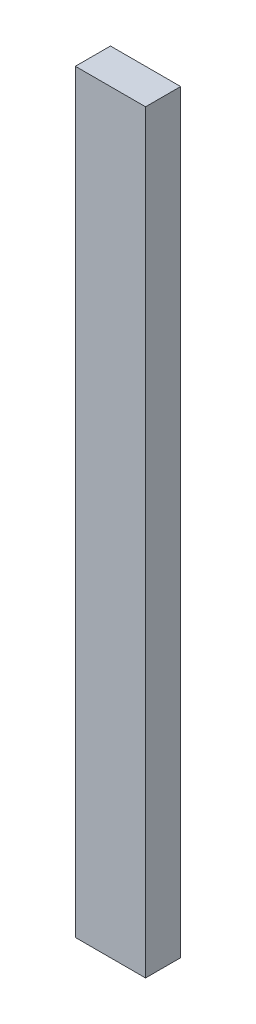
ISO-10303-21;
HEADER;
FILE_DESCRIPTION(('STEP AP214'),'2;1');
FILE_NAME('part.step','',(''),(''),'','','');
FILE_SCHEMA(('AUTOMOTIVE_DESIGN { 1 0 10303 214 1 1 1 1 }'));
ENDSEC;
DATA;
#1=APPLICATION_CONTEXT('core data for automotive mechanical design processes');
#2=APPLICATION_PROTOCOL_DEFINITION('international standard','automotive_design',2000,#1);
#3=PRODUCT_CONTEXT('',#1,'mechanical');
#4=PRODUCT('Part','Part','',(#3));
#5=PRODUCT_RELATED_PRODUCT_CATEGORY('part','',(#4));
#6=PRODUCT_DEFINITION_FORMATION('','',#4);
#7=PRODUCT_DEFINITION_CONTEXT('part definition',#1,'design');
#8=PRODUCT_DEFINITION('design','',#6,#7);
#9=PRODUCT_DEFINITION_SHAPE('','',#8);
#10=(LENGTH_UNIT() NAMED_UNIT(*) SI_UNIT(.MILLI.,.METRE.));
#11=(NAMED_UNIT(*) PLANE_ANGLE_UNIT() SI_UNIT($,.RADIAN.));
#12=(NAMED_UNIT(*) SI_UNIT($,.STERADIAN.) SOLID_ANGLE_UNIT());
#13=UNCERTAINTY_MEASURE_WITH_UNIT(LENGTH_MEASURE(1.E-05),#10,'distance_accuracy_value','');
#14=(GEOMETRIC_REPRESENTATION_CONTEXT(3) GLOBAL_UNCERTAINTY_ASSIGNED_CONTEXT((#13)) GLOBAL_UNIT_ASSIGNED_CONTEXT((#10,
#11,#12)) REPRESENTATION_CONTEXT('',''));
#15=CARTESIAN_POINT('',(0.,0.,0.));
#16=DIRECTION('',(0.,0.,1.));
#17=DIRECTION('',(1.,0.,0.));
#18=AXIS2_PLACEMENT_3D('',#15,#16,#17);
#19=CARTESIAN_POINT('',(12.7,-7.93749999999993,6.35));
#20=DIRECTION('',(-1.,0.,0.));
#21=DIRECTION('',(0.,0.,1.));
#22=AXIS2_PLACEMENT_3D('',#19,#20,#21);
#23=PLANE('',#22);
#24=DIRECTION('',(0.,1.,0.));
#25=VECTOR('',#24,1.);
#26=CARTESIAN_POINT('',(12.7,-7.93749999999993,0.));
#27=LINE('',#26,#25);
#28=CARTESIAN_POINT('',(12.7,-144.4625,0.));
#29=VERTEX_POINT('',#28);
#30=CARTESIAN_POINT('',(12.7,-7.93749999999993,0.));
#31=VERTEX_POINT('',#30);
#32=EDGE_CURVE('E96',#29,#31,#27,.T.);
#33=ORIENTED_EDGE('',*,*,#32,.T.);
#34=DIRECTION('',(0.,0.,-1.));
#35=VECTOR('',#34,1.);
#36=CARTESIAN_POINT('',(12.7,-7.93749999999993,6.35));
#37=LINE('',#36,#35);
#38=CARTESIAN_POINT('',(12.7,-7.93749999999993,6.35));
#39=VERTEX_POINT('',#38);
#40=EDGE_CURVE('E11',#39,#31,#37,.T.);
#41=ORIENTED_EDGE('',*,*,#40,.F.);
#42=DIRECTION('',(0.,1.,0.));
#43=VECTOR('',#42,1.);
#44=CARTESIAN_POINT('',(12.7,-7.93749999999993,6.35));
#45=LINE('',#44,#43);
#46=CARTESIAN_POINT('',(12.7,-144.4625,6.35));
#47=VERTEX_POINT('',#46);
#48=EDGE_CURVE('E84',#47,#39,#45,.T.);
#49=ORIENTED_EDGE('',*,*,#48,.F.);
#50=DIRECTION('',(0.,0.,-1.));
#51=VECTOR('',#50,1.);
#52=CARTESIAN_POINT('',(12.7,-144.4625,6.35));
#53=LINE('',#52,#51);
#54=EDGE_CURVE('E92',#47,#29,#53,.T.);
#55=ORIENTED_EDGE('',*,*,#54,.T.);
#56=EDGE_LOOP('',(#33,#41,#49,#55));
#57=FACE_BOUND('',#56,.T.);
#58=ADVANCED_FACE('F33',(#57),#23,.F.);
#59=CARTESIAN_POINT('',(12.7,-7.93749999999993,6.35));
#60=DIRECTION('',(0.,-1.,0.));
#61=DIRECTION('',(0.,0.,-1.));
#62=AXIS2_PLACEMENT_3D('',#59,#60,#61);
#63=PLANE('',#62);
#64=DIRECTION('',(-1.,0.,0.));
#65=VECTOR('',#64,1.);
#66=CARTESIAN_POINT('',(12.7,-7.93749999999993,0.));
#67=LINE('',#66,#65);
#68=CARTESIAN_POINT('',(0.,-7.93749999999993,0.));
#69=VERTEX_POINT('',#68);
#70=EDGE_CURVE('E88',#31,#69,#67,.T.);
#71=ORIENTED_EDGE('',*,*,#70,.T.);
#72=DIRECTION('',(0.,0.,-1.));
#73=VECTOR('',#72,1.);
#74=CARTESIAN_POINT('',(0.,-7.93749999999993,6.35));
#75=LINE('',#74,#73);
#76=CARTESIAN_POINT('',(0.,-7.93749999999993,6.35));
#77=VERTEX_POINT('',#76);
#78=EDGE_CURVE('E41',#77,#69,#75,.T.);
#79=ORIENTED_EDGE('',*,*,#78,.F.);
#80=DIRECTION('',(-1.,0.,0.));
#81=VECTOR('',#80,1.);
#82=CARTESIAN_POINT('',(12.7,-7.93749999999993,6.35));
#83=LINE('',#82,#81);
#84=EDGE_CURVE('E79',#39,#77,#83,.T.);
#85=ORIENTED_EDGE('',*,*,#84,.F.);
#86=ORIENTED_EDGE('',*,*,#40,.T.);
#87=EDGE_LOOP('',(#71,#79,#85,#86));
#88=FACE_BOUND('',#87,.T.);
#89=ADVANCED_FACE('F87',(#88),#63,.F.);
#90=CARTESIAN_POINT('',(0.,-7.93749999999993,6.35));
#91=DIRECTION('',(1.,0.,0.));
#92=DIRECTION('',(0.,0.,-1.));
#93=AXIS2_PLACEMENT_3D('',#90,#91,#92);
#94=PLANE('',#93);
#95=DIRECTION('',(0.,-1.,0.));
#96=VECTOR('',#95,1.);
#97=CARTESIAN_POINT('',(0.,-7.93749999999993,0.));
#98=LINE('',#97,#96);
#99=CARTESIAN_POINT('',(0.,-144.4625,0.));
#100=VERTEX_POINT('',#99);
#101=EDGE_CURVE('E66',#69,#100,#98,.T.);
#102=ORIENTED_EDGE('',*,*,#101,.T.);
#103=DIRECTION('',(0.,0.,-1.));
#104=VECTOR('',#103,1.);
#105=CARTESIAN_POINT('',(0.,-144.4625,6.35));
#106=LINE('',#105,#104);
#107=CARTESIAN_POINT('',(0.,-144.4625,6.35));
#108=VERTEX_POINT('',#107);
#109=EDGE_CURVE('E89',#108,#100,#106,.T.);
#110=ORIENTED_EDGE('',*,*,#109,.F.);
#111=DIRECTION('',(0.,-1.,0.));
#112=VECTOR('',#111,1.);
#113=CARTESIAN_POINT('',(0.,-7.93749999999993,6.35));
#114=LINE('',#113,#112);
#115=EDGE_CURVE('E82',#77,#108,#114,.T.);
#116=ORIENTED_EDGE('',*,*,#115,.F.);
#117=ORIENTED_EDGE('',*,*,#78,.T.);
#118=EDGE_LOOP('',(#102,#110,#116,#117));
#119=FACE_BOUND('',#118,.T.);
#120=ADVANCED_FACE('F90',(#119),#94,.F.);
#121=CARTESIAN_POINT('',(12.7,-144.4625,6.35));
#122=DIRECTION('',(0.,1.,0.));
#123=DIRECTION('',(0.,0.,1.));
#124=AXIS2_PLACEMENT_3D('',#121,#122,#123);
#125=PLANE('',#124);
#126=DIRECTION('',(1.,0.,0.));
#127=VECTOR('',#126,1.);
#128=CARTESIAN_POINT('',(12.7,-144.4625,0.));
#129=LINE('',#128,#127);
#130=EDGE_CURVE('E72',#100,#29,#129,.T.);
#131=ORIENTED_EDGE('',*,*,#130,.T.);
#132=ORIENTED_EDGE('',*,*,#54,.F.);
#133=DIRECTION('',(1.,0.,0.));
#134=VECTOR('',#133,1.);
#135=CARTESIAN_POINT('',(12.7,-144.4625,6.35));
#136=LINE('',#135,#134);
#137=EDGE_CURVE('E49',#108,#47,#136,.T.);
#138=ORIENTED_EDGE('',*,*,#137,.F.);
#139=ORIENTED_EDGE('',*,*,#109,.T.);
#140=EDGE_LOOP('',(#131,#132,#138,#139));
#141=FACE_BOUND('',#140,.T.);
#142=ADVANCED_FACE('F103',(#141),#125,.F.);
#143=CARTESIAN_POINT('',(0.,0.,6.35));
#144=DIRECTION('',(0.,0.,-1.));
#145=DIRECTION('',(-1.,0.,0.));
#146=AXIS2_PLACEMENT_3D('',#143,#144,#145);
#147=PLANE('',#146);
#148=ORIENTED_EDGE('',*,*,#48,.T.);
#149=ORIENTED_EDGE('',*,*,#84,.T.);
#150=ORIENTED_EDGE('',*,*,#115,.T.);
#151=ORIENTED_EDGE('',*,*,#137,.T.);
#152=EDGE_LOOP('',(#148,#149,#150,#151));
#153=FACE_BOUND('',#152,.T.);
#154=ADVANCED_FACE('F80',(#153),#147,.F.);
#155=CARTESIAN_POINT('',(0.,0.,0.));
#156=DIRECTION('',(0.,0.,-1.));
#157=DIRECTION('',(-1.,0.,0.));
#158=AXIS2_PLACEMENT_3D('',#155,#156,#157);
#159=PLANE('',#158);
#160=ORIENTED_EDGE('',*,*,#32,.F.);
#161=ORIENTED_EDGE('',*,*,#130,.F.);
#162=ORIENTED_EDGE('',*,*,#101,.F.);
#163=ORIENTED_EDGE('',*,*,#70,.F.);
#164=EDGE_LOOP('',(#160,#161,#162,#163));
#165=FACE_BOUND('',#164,.T.);
#166=ADVANCED_FACE('F106',(#165),#159,.T.);
#167=CLOSED_SHELL('',(#58,#89,#120,#142,#154,#166));
#168=MANIFOLD_SOLID_BREP('B2',#167);
#169=ADVANCED_BREP_SHAPE_REPRESENTATION('',(#18,#168),#14);
#170=SHAPE_DEFINITION_REPRESENTATION(#9,#169);
ENDSEC;
END-ISO-10303-21;
